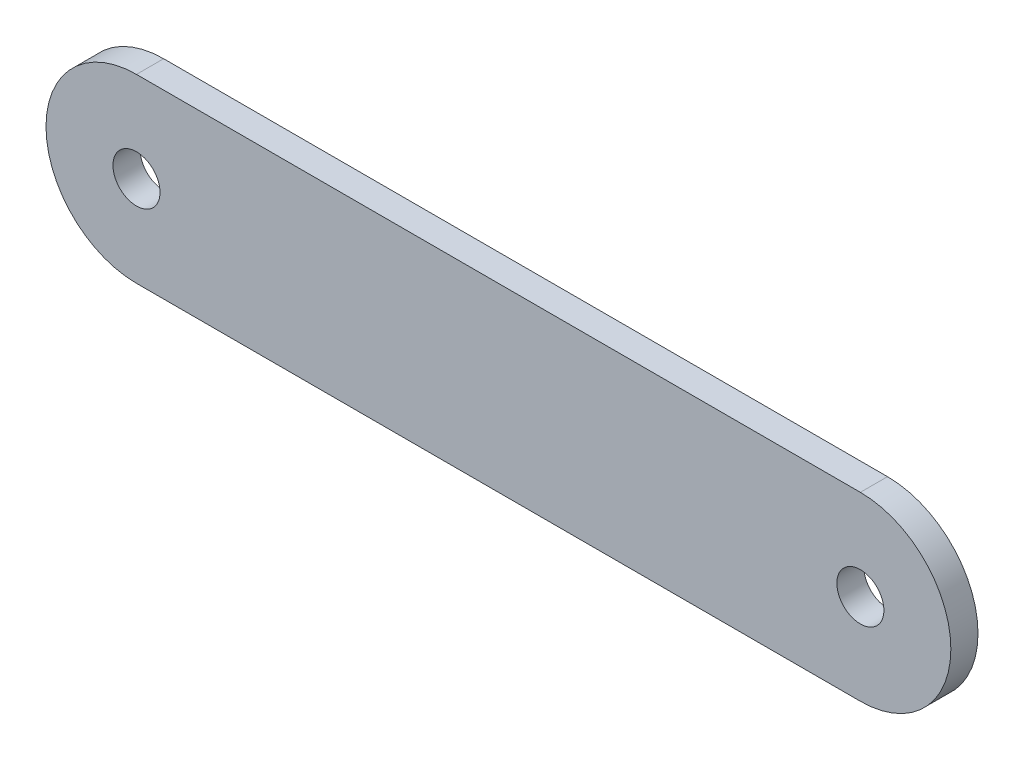
ISO-10303-21;
HEADER;
FILE_DESCRIPTION(('STEP AP214'),'2;1');
FILE_NAME('part.step','',(''),(''),'','','');
FILE_SCHEMA(('AUTOMOTIVE_DESIGN { 1 0 10303 214 1 1 1 1 }'));
ENDSEC;
DATA;
#1=APPLICATION_CONTEXT('core data for automotive mechanical design processes');
#2=APPLICATION_PROTOCOL_DEFINITION('international standard','automotive_design',2000,#1);
#3=PRODUCT_CONTEXT('',#1,'mechanical');
#4=PRODUCT('Part','Part','',(#3));
#5=PRODUCT_RELATED_PRODUCT_CATEGORY('part','',(#4));
#6=PRODUCT_DEFINITION_FORMATION('','',#4);
#7=PRODUCT_DEFINITION_CONTEXT('part definition',#1,'design');
#8=PRODUCT_DEFINITION('design','',#6,#7);
#9=PRODUCT_DEFINITION_SHAPE('','',#8);
#10=(LENGTH_UNIT() NAMED_UNIT(*) SI_UNIT(.MILLI.,.METRE.));
#11=(NAMED_UNIT(*) PLANE_ANGLE_UNIT() SI_UNIT($,.RADIAN.));
#12=(NAMED_UNIT(*) SI_UNIT($,.STERADIAN.) SOLID_ANGLE_UNIT());
#13=UNCERTAINTY_MEASURE_WITH_UNIT(LENGTH_MEASURE(1.E-05),#10,'distance_accuracy_value','');
#14=(GEOMETRIC_REPRESENTATION_CONTEXT(3) GLOBAL_UNCERTAINTY_ASSIGNED_CONTEXT((#13)) GLOBAL_UNIT_ASSIGNED_CONTEXT((#10,
#11,#12)) REPRESENTATION_CONTEXT('',''));
#15=CARTESIAN_POINT('',(0.,0.,0.));
#16=DIRECTION('',(0.,0.,1.));
#17=DIRECTION('',(1.,0.,0.));
#18=AXIS2_PLACEMENT_3D('',#15,#16,#17);
#19=CARTESIAN_POINT('',(-40.,0.,3.));
#20=DIRECTION('',(0.,0.,1.));
#21=DIRECTION('',(1.,0.,0.));
#22=AXIS2_PLACEMENT_3D('',#19,#20,#21);
#23=PLANE('',#22);
#24=CARTESIAN_POINT('',(-40.,0.,3.));
#25=DIRECTION('',(0.,0.,1.));
#26=DIRECTION('',(1.,0.,0.));
#27=AXIS2_PLACEMENT_3D('',#24,#25,#26);
#28=CIRCLE('',#27,2.6);
#29=CARTESIAN_POINT('',(-37.4,0.,3.));
#30=VERTEX_POINT('',#29);
#31=EDGE_CURVE('E103',#30,#30,#28,.T.);
#32=ORIENTED_EDGE('',*,*,#31,.F.);
#33=EDGE_LOOP('',(#32));
#34=FACE_BOUND('',#33,.T.);
#35=CARTESIAN_POINT('',(-40.,0.,3.));
#36=DIRECTION('',(0.,0.,1.));
#37=DIRECTION('',(1.,0.,0.));
#38=AXIS2_PLACEMENT_3D('',#35,#36,#37);
#39=CIRCLE('',#38,10.);
#40=CARTESIAN_POINT('',(-40.,10.,3.));
#41=VERTEX_POINT('',#40);
#42=CARTESIAN_POINT('',(-40.,-10.,3.));
#43=VERTEX_POINT('',#42);
#44=EDGE_CURVE('E88',#41,#43,#39,.T.);
#45=ORIENTED_EDGE('',*,*,#44,.T.);
#46=DIRECTION('',(1.,0.,0.));
#47=VECTOR('',#46,1.);
#48=CARTESIAN_POINT('',(-40.,-10.,3.));
#49=LINE('',#48,#47);
#50=CARTESIAN_POINT('',(40.,-9.99999999999999,3.));
#51=VERTEX_POINT('',#50);
#52=EDGE_CURVE('E83',#43,#51,#49,.T.);
#53=ORIENTED_EDGE('',*,*,#52,.T.);
#54=CARTESIAN_POINT('',(40.,0.,3.));
#55=DIRECTION('',(0.,0.,1.));
#56=DIRECTION('',(1.,0.,0.));
#57=AXIS2_PLACEMENT_3D('',#54,#55,#56);
#58=CIRCLE('',#57,10.);
#59=CARTESIAN_POINT('',(40.,10.,3.));
#60=VERTEX_POINT('',#59);
#61=EDGE_CURVE('E86',#51,#60,#58,.T.);
#62=ORIENTED_EDGE('',*,*,#61,.T.);
#63=DIRECTION('',(-1.,0.,0.));
#64=VECTOR('',#63,1.);
#65=CARTESIAN_POINT('',(-40.,10.,3.));
#66=LINE('',#65,#64);
#67=EDGE_CURVE('E53',#60,#41,#66,.T.);
#68=ORIENTED_EDGE('',*,*,#67,.T.);
#69=EDGE_LOOP('',(#45,#53,#62,#68));
#70=FACE_BOUND('',#69,.T.);
#71=CARTESIAN_POINT('',(40.,0.,3.));
#72=DIRECTION('',(0.,0.,1.));
#73=DIRECTION('',(-1.,0.,0.));
#74=AXIS2_PLACEMENT_3D('',#71,#72,#73);
#75=CIRCLE('',#74,2.6);
#76=CARTESIAN_POINT('',(37.4,0.,3.));
#77=VERTEX_POINT('',#76);
#78=EDGE_CURVE('E118',#77,#77,#75,.T.);
#79=ORIENTED_EDGE('',*,*,#78,.F.);
#80=EDGE_LOOP('',(#79));
#81=FACE_BOUND('',#80,.T.);
#82=ADVANCED_FACE('F36',(#34,#70,#81),#23,.T.);
#83=CARTESIAN_POINT('',(-40.,0.,0.));
#84=DIRECTION('',(0.,0.,1.));
#85=DIRECTION('',(1.,0.,0.));
#86=AXIS2_PLACEMENT_3D('',#83,#84,#85);
#87=PLANE('',#86);
#88=CARTESIAN_POINT('',(-40.,0.,0.));
#89=DIRECTION('',(0.,0.,1.));
#90=DIRECTION('',(1.,0.,0.));
#91=AXIS2_PLACEMENT_3D('',#88,#89,#90);
#92=CIRCLE('',#91,10.);
#93=CARTESIAN_POINT('',(-40.,10.,0.));
#94=VERTEX_POINT('',#93);
#95=CARTESIAN_POINT('',(-40.,-10.,0.));
#96=VERTEX_POINT('',#95);
#97=EDGE_CURVE('E100',#94,#96,#92,.T.);
#98=ORIENTED_EDGE('',*,*,#97,.F.);
#99=DIRECTION('',(-1.,0.,0.));
#100=VECTOR('',#99,1.);
#101=CARTESIAN_POINT('',(-40.,10.,0.));
#102=LINE('',#101,#100);
#103=CARTESIAN_POINT('',(40.,10.,0.));
#104=VERTEX_POINT('',#103);
#105=EDGE_CURVE('E76',#104,#94,#102,.T.);
#106=ORIENTED_EDGE('',*,*,#105,.F.);
#107=CARTESIAN_POINT('',(40.,0.,0.));
#108=DIRECTION('',(0.,0.,1.));
#109=DIRECTION('',(1.,0.,0.));
#110=AXIS2_PLACEMENT_3D('',#107,#108,#109);
#111=CIRCLE('',#110,10.);
#112=CARTESIAN_POINT('',(40.,-9.99999999999999,0.));
#113=VERTEX_POINT('',#112);
#114=EDGE_CURVE('E70',#113,#104,#111,.T.);
#115=ORIENTED_EDGE('',*,*,#114,.F.);
#116=DIRECTION('',(1.,0.,0.));
#117=VECTOR('',#116,1.);
#118=CARTESIAN_POINT('',(-40.,-10.,0.));
#119=LINE('',#118,#117);
#120=EDGE_CURVE('E92',#96,#113,#119,.T.);
#121=ORIENTED_EDGE('',*,*,#120,.F.);
#122=EDGE_LOOP('',(#98,#106,#115,#121));
#123=FACE_BOUND('',#122,.T.);
#124=CARTESIAN_POINT('',(-40.,0.,0.));
#125=DIRECTION('',(0.,0.,1.));
#126=DIRECTION('',(1.,0.,0.));
#127=AXIS2_PLACEMENT_3D('',#124,#125,#126);
#128=CIRCLE('',#127,2.6);
#129=CARTESIAN_POINT('',(-37.4,0.,0.));
#130=VERTEX_POINT('',#129);
#131=EDGE_CURVE('E115',#130,#130,#128,.T.);
#132=ORIENTED_EDGE('',*,*,#131,.T.);
#133=EDGE_LOOP('',(#132));
#134=FACE_BOUND('',#133,.T.);
#135=CARTESIAN_POINT('',(40.,0.,0.));
#136=DIRECTION('',(0.,0.,1.));
#137=DIRECTION('',(-1.,0.,0.));
#138=AXIS2_PLACEMENT_3D('',#135,#136,#137);
#139=CIRCLE('',#138,2.6);
#140=CARTESIAN_POINT('',(37.4,0.,0.));
#141=VERTEX_POINT('',#140);
#142=EDGE_CURVE('E121',#141,#141,#139,.T.);
#143=ORIENTED_EDGE('',*,*,#142,.T.);
#144=EDGE_LOOP('',(#143));
#145=FACE_BOUND('',#144,.T.);
#146=ADVANCED_FACE('F111',(#123,#134,#145),#87,.F.);
#147=CARTESIAN_POINT('',(-40.,0.,3.));
#148=DIRECTION('',(0.,0.,-1.));
#149=DIRECTION('',(-1.,0.,0.));
#150=AXIS2_PLACEMENT_3D('',#147,#148,#149);
#151=CYLINDRICAL_SURFACE('',#150,10.);
#152=ORIENTED_EDGE('',*,*,#97,.T.);
#153=DIRECTION('',(0.,0.,-1.));
#154=VECTOR('',#153,1.);
#155=CARTESIAN_POINT('',(-40.,-10.,3.));
#156=LINE('',#155,#154);
#157=EDGE_CURVE('E11',#43,#96,#156,.T.);
#158=ORIENTED_EDGE('',*,*,#157,.F.);
#159=ORIENTED_EDGE('',*,*,#44,.F.);
#160=DIRECTION('',(0.,0.,-1.));
#161=VECTOR('',#160,1.);
#162=CARTESIAN_POINT('',(-40.,10.,3.));
#163=LINE('',#162,#161);
#164=EDGE_CURVE('E96',#41,#94,#163,.T.);
#165=ORIENTED_EDGE('',*,*,#164,.T.);
#166=EDGE_LOOP('',(#152,#158,#159,#165));
#167=FACE_BOUND('',#166,.T.);
#168=ADVANCED_FACE('F38',(#167),#151,.T.);
#169=CARTESIAN_POINT('',(-40.,-10.,3.));
#170=DIRECTION('',(0.,1.,0.));
#171=DIRECTION('',(-1.,0.,0.));
#172=AXIS2_PLACEMENT_3D('',#169,#170,#171);
#173=PLANE('',#172);
#174=ORIENTED_EDGE('',*,*,#120,.T.);
#175=DIRECTION('',(0.,0.,-1.));
#176=VECTOR('',#175,1.);
#177=CARTESIAN_POINT('',(40.,-9.99999999999999,3.));
#178=LINE('',#177,#176);
#179=EDGE_CURVE('E45',#51,#113,#178,.T.);
#180=ORIENTED_EDGE('',*,*,#179,.F.);
#181=ORIENTED_EDGE('',*,*,#52,.F.);
#182=ORIENTED_EDGE('',*,*,#157,.T.);
#183=EDGE_LOOP('',(#174,#180,#181,#182));
#184=FACE_BOUND('',#183,.T.);
#185=ADVANCED_FACE('F91',(#184),#173,.F.);
#186=CARTESIAN_POINT('',(40.,0.,3.));
#187=DIRECTION('',(0.,0.,-1.));
#188=DIRECTION('',(-1.,0.,0.));
#189=AXIS2_PLACEMENT_3D('',#186,#187,#188);
#190=CYLINDRICAL_SURFACE('',#189,10.);
#191=ORIENTED_EDGE('',*,*,#114,.T.);
#192=DIRECTION('',(0.,0.,-1.));
#193=VECTOR('',#192,1.);
#194=CARTESIAN_POINT('',(40.,10.,3.));
#195=LINE('',#194,#193);
#196=EDGE_CURVE('E93',#60,#104,#195,.T.);
#197=ORIENTED_EDGE('',*,*,#196,.F.);
#198=ORIENTED_EDGE('',*,*,#61,.F.);
#199=ORIENTED_EDGE('',*,*,#179,.T.);
#200=EDGE_LOOP('',(#191,#197,#198,#199));
#201=FACE_BOUND('',#200,.T.);
#202=ADVANCED_FACE('F94',(#201),#190,.T.);
#203=CARTESIAN_POINT('',(-40.,10.,3.));
#204=DIRECTION('',(0.,-1.,0.));
#205=DIRECTION('',(1.,0.,0.));
#206=AXIS2_PLACEMENT_3D('',#203,#204,#205);
#207=PLANE('',#206);
#208=ORIENTED_EDGE('',*,*,#105,.T.);
#209=ORIENTED_EDGE('',*,*,#164,.F.);
#210=ORIENTED_EDGE('',*,*,#67,.F.);
#211=ORIENTED_EDGE('',*,*,#196,.T.);
#212=EDGE_LOOP('',(#208,#209,#210,#211));
#213=FACE_BOUND('',#212,.T.);
#214=ADVANCED_FACE('F108',(#213),#207,.F.);
#215=CARTESIAN_POINT('',(-40.,0.,3.));
#216=DIRECTION('',(0.,0.,-1.));
#217=DIRECTION('',(-1.,0.,0.));
#218=AXIS2_PLACEMENT_3D('',#215,#216,#217);
#219=CYLINDRICAL_SURFACE('',#218,2.6);
#220=ORIENTED_EDGE('',*,*,#31,.T.);
#221=EDGE_LOOP('',(#220));
#222=FACE_BOUND('',#221,.T.);
#223=ORIENTED_EDGE('',*,*,#131,.F.);
#224=EDGE_LOOP('',(#223));
#225=FACE_BOUND('',#224,.T.);
#226=ADVANCED_FACE('F138',(#222,#225),#219,.F.);
#227=CARTESIAN_POINT('',(40.,0.,3.));
#228=DIRECTION('',(0.,0.,-1.));
#229=DIRECTION('',(-1.,0.,0.));
#230=AXIS2_PLACEMENT_3D('',#227,#228,#229);
#231=CYLINDRICAL_SURFACE('',#230,2.6);
#232=ORIENTED_EDGE('',*,*,#78,.T.);
#233=EDGE_LOOP('',(#232));
#234=FACE_BOUND('',#233,.T.);
#235=ORIENTED_EDGE('',*,*,#142,.F.);
#236=EDGE_LOOP('',(#235));
#237=FACE_BOUND('',#236,.T.);
#238=ADVANCED_FACE('F127',(#234,#237),#231,.F.);
#239=CLOSED_SHELL('',(#82,#146,#168,#185,#202,#214,#226,#238));
#240=MANIFOLD_SOLID_BREP('B2',#239);
#241=ADVANCED_BREP_SHAPE_REPRESENTATION('',(#18,#240),#14);
#242=SHAPE_DEFINITION_REPRESENTATION(#9,#241);
ENDSEC;
END-ISO-10303-21;
